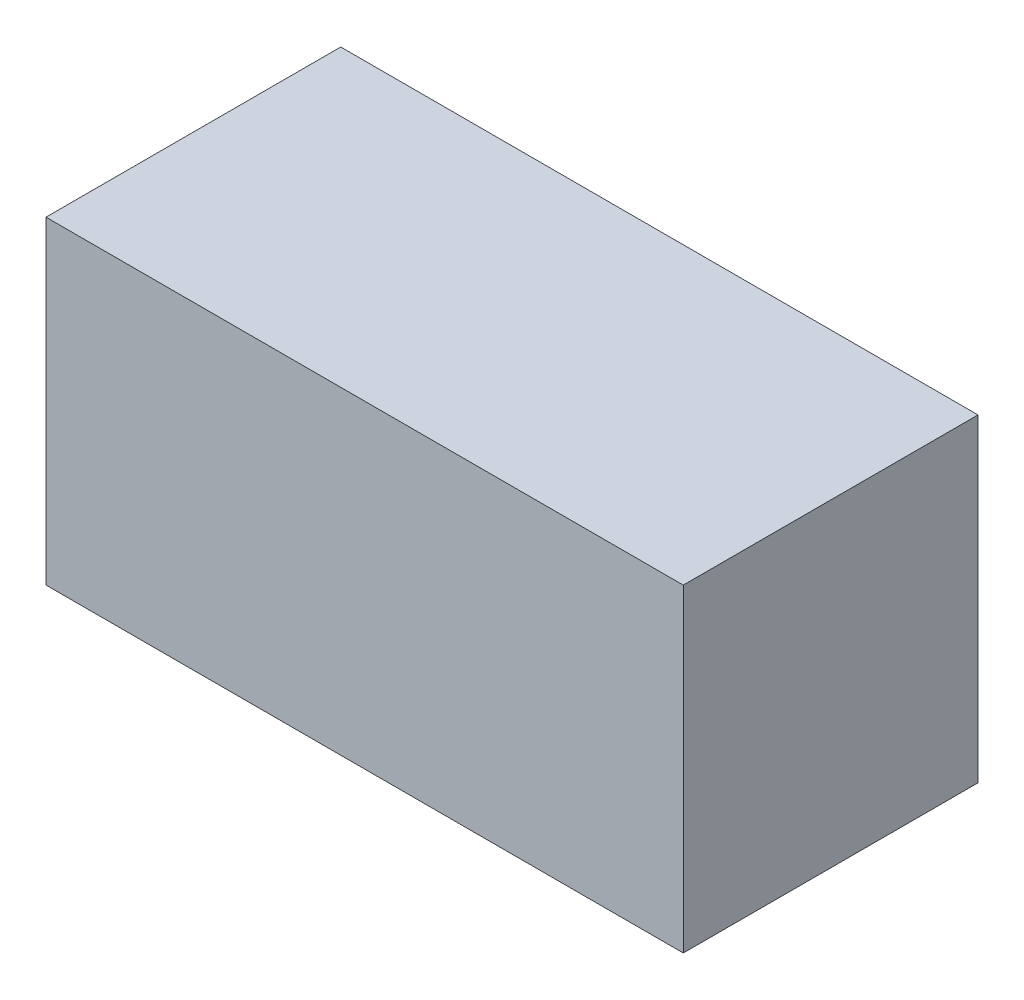
ISO-10303-21;
HEADER;
FILE_DESCRIPTION(('STEP AP214'),'2;1');
FILE_NAME('part.step','',(''),(''),'','','');
FILE_SCHEMA(('AUTOMOTIVE_DESIGN { 1 0 10303 214 1 1 1 1 }'));
ENDSEC;
DATA;
#1=APPLICATION_CONTEXT('core data for automotive mechanical design processes');
#2=APPLICATION_PROTOCOL_DEFINITION('international standard','automotive_design',2000,#1);
#3=PRODUCT_CONTEXT('',#1,'mechanical');
#4=PRODUCT('Part','Part','',(#3));
#5=PRODUCT_RELATED_PRODUCT_CATEGORY('part','',(#4));
#6=PRODUCT_DEFINITION_FORMATION('','',#4);
#7=PRODUCT_DEFINITION_CONTEXT('part definition',#1,'design');
#8=PRODUCT_DEFINITION('design','',#6,#7);
#9=PRODUCT_DEFINITION_SHAPE('','',#8);
#10=(LENGTH_UNIT() NAMED_UNIT(*) SI_UNIT(.MILLI.,.METRE.));
#11=(NAMED_UNIT(*) PLANE_ANGLE_UNIT() SI_UNIT($,.RADIAN.));
#12=(NAMED_UNIT(*) SI_UNIT($,.STERADIAN.) SOLID_ANGLE_UNIT());
#13=UNCERTAINTY_MEASURE_WITH_UNIT(LENGTH_MEASURE(1.E-05),#10,'distance_accuracy_value','');
#14=(GEOMETRIC_REPRESENTATION_CONTEXT(3) GLOBAL_UNCERTAINTY_ASSIGNED_CONTEXT((#13)) GLOBAL_UNIT_ASSIGNED_CONTEXT((#10,
#11,#12)) REPRESENTATION_CONTEXT('',''));
#15=CARTESIAN_POINT('',(0.,0.,0.));
#16=DIRECTION('',(0.,0.,1.));
#17=DIRECTION('',(1.,0.,0.));
#18=AXIS2_PLACEMENT_3D('',#15,#16,#17);
#19=CARTESIAN_POINT('',(-400.,-200.,370.));
#20=DIRECTION('',(0.,1.,0.));
#21=DIRECTION('',(0.,0.,1.));
#22=AXIS2_PLACEMENT_3D('',#19,#20,#21);
#23=PLANE('',#22);
#24=DIRECTION('',(1.,0.,0.));
#25=VECTOR('',#24,1.);
#26=CARTESIAN_POINT('',(-400.,-200.,0.));
#27=LINE('',#26,#25);
#28=CARTESIAN_POINT('',(-400.,-200.,0.));
#29=VERTEX_POINT('',#28);
#30=CARTESIAN_POINT('',(400.,-200.,0.));
#31=VERTEX_POINT('',#30);
#32=EDGE_CURVE('E99',#29,#31,#27,.T.);
#33=ORIENTED_EDGE('',*,*,#32,.T.);
#34=DIRECTION('',(0.,0.,-1.));
#35=VECTOR('',#34,1.);
#36=CARTESIAN_POINT('',(400.,-200.,370.));
#37=LINE('',#36,#35);
#38=CARTESIAN_POINT('',(400.,-200.,370.));
#39=VERTEX_POINT('',#38);
#40=EDGE_CURVE('E11',#39,#31,#37,.T.);
#41=ORIENTED_EDGE('',*,*,#40,.F.);
#42=DIRECTION('',(1.,0.,0.));
#43=VECTOR('',#42,1.);
#44=CARTESIAN_POINT('',(-400.,-200.,370.));
#45=LINE('',#44,#43);
#46=CARTESIAN_POINT('',(-400.,-200.,370.));
#47=VERTEX_POINT('',#46);
#48=EDGE_CURVE('E76',#47,#39,#45,.T.);
#49=ORIENTED_EDGE('',*,*,#48,.F.);
#50=DIRECTION('',(0.,0.,-1.));
#51=VECTOR('',#50,1.);
#52=CARTESIAN_POINT('',(-400.,-200.,370.));
#53=LINE('',#52,#51);
#54=EDGE_CURVE('E95',#47,#29,#53,.T.);
#55=ORIENTED_EDGE('',*,*,#54,.T.);
#56=EDGE_LOOP('',(#33,#41,#49,#55));
#57=FACE_BOUND('',#56,.T.);
#58=ADVANCED_FACE('F37',(#57),#23,.F.);
#59=CARTESIAN_POINT('',(400.,200.,370.));
#60=DIRECTION('',(1.,0.,0.));
#61=DIRECTION('',(0.,1.,0.));
#62=AXIS2_PLACEMENT_3D('',#59,#60,#61);
#63=PLANE('',#62);
#64=DIRECTION('',(0.,-1.,0.));
#65=VECTOR('',#64,1.);
#66=CARTESIAN_POINT('',(400.,200.,0.));
#67=LINE('',#66,#65);
#68=CARTESIAN_POINT('',(400.,200.,0.));
#69=VERTEX_POINT('',#68);
#70=EDGE_CURVE('E85',#69,#31,#67,.T.);
#71=ORIENTED_EDGE('',*,*,#70,.F.);
#72=DIRECTION('',(0.,0.,-1.));
#73=VECTOR('',#72,1.);
#74=CARTESIAN_POINT('',(400.,200.,370.));
#75=LINE('',#74,#73);
#76=CARTESIAN_POINT('',(400.,200.,370.));
#77=VERTEX_POINT('',#76);
#78=EDGE_CURVE('E45',#77,#69,#75,.T.);
#79=ORIENTED_EDGE('',*,*,#78,.F.);
#80=DIRECTION('',(0.,-1.,0.));
#81=VECTOR('',#80,1.);
#82=CARTESIAN_POINT('',(400.,200.,370.));
#83=LINE('',#82,#81);
#84=EDGE_CURVE('E83',#77,#39,#83,.T.);
#85=ORIENTED_EDGE('',*,*,#84,.T.);
#86=ORIENTED_EDGE('',*,*,#40,.T.);
#87=EDGE_LOOP('',(#71,#79,#85,#86));
#88=FACE_BOUND('',#87,.T.);
#89=ADVANCED_FACE('F82',(#88),#63,.T.);
#90=CARTESIAN_POINT('',(-400.,200.,370.));
#91=DIRECTION('',(0.,1.,0.));
#92=DIRECTION('',(0.,0.,1.));
#93=AXIS2_PLACEMENT_3D('',#90,#91,#92);
#94=PLANE('',#93);
#95=DIRECTION('',(1.,0.,0.));
#96=VECTOR('',#95,1.);
#97=CARTESIAN_POINT('',(-400.,200.,0.));
#98=LINE('',#97,#96);
#99=CARTESIAN_POINT('',(-400.,200.,0.));
#100=VERTEX_POINT('',#99);
#101=EDGE_CURVE('E103',#100,#69,#98,.T.);
#102=ORIENTED_EDGE('',*,*,#101,.F.);
#103=DIRECTION('',(0.,0.,-1.));
#104=VECTOR('',#103,1.);
#105=CARTESIAN_POINT('',(-400.,200.,370.));
#106=LINE('',#105,#104);
#107=CARTESIAN_POINT('',(-400.,200.,370.));
#108=VERTEX_POINT('',#107);
#109=EDGE_CURVE('E68',#108,#100,#106,.T.);
#110=ORIENTED_EDGE('',*,*,#109,.F.);
#111=DIRECTION('',(1.,0.,0.));
#112=VECTOR('',#111,1.);
#113=CARTESIAN_POINT('',(-400.,200.,370.));
#114=LINE('',#113,#112);
#115=EDGE_CURVE('E91',#108,#77,#114,.T.);
#116=ORIENTED_EDGE('',*,*,#115,.T.);
#117=ORIENTED_EDGE('',*,*,#78,.T.);
#118=EDGE_LOOP('',(#102,#110,#116,#117));
#119=FACE_BOUND('',#118,.T.);
#120=ADVANCED_FACE('F93',(#119),#94,.T.);
#121=CARTESIAN_POINT('',(-400.,200.,370.));
#122=DIRECTION('',(1.,0.,0.));
#123=DIRECTION('',(0.,1.,0.));
#124=AXIS2_PLACEMENT_3D('',#121,#122,#123);
#125=PLANE('',#124);
#126=DIRECTION('',(0.,-1.,0.));
#127=VECTOR('',#126,1.);
#128=CARTESIAN_POINT('',(-400.,200.,0.));
#129=LINE('',#128,#127);
#130=EDGE_CURVE('E71',#100,#29,#129,.T.);
#131=ORIENTED_EDGE('',*,*,#130,.T.);
#132=ORIENTED_EDGE('',*,*,#54,.F.);
#133=DIRECTION('',(0.,-1.,0.));
#134=VECTOR('',#133,1.);
#135=CARTESIAN_POINT('',(-400.,200.,370.));
#136=LINE('',#135,#134);
#137=EDGE_CURVE('E53',#108,#47,#136,.T.);
#138=ORIENTED_EDGE('',*,*,#137,.F.);
#139=ORIENTED_EDGE('',*,*,#109,.T.);
#140=EDGE_LOOP('',(#131,#132,#138,#139));
#141=FACE_BOUND('',#140,.T.);
#142=ADVANCED_FACE('F116',(#141),#125,.F.);
#143=CARTESIAN_POINT('',(0.,0.,370.));
#144=DIRECTION('',(0.,0.,-1.));
#145=DIRECTION('',(-1.,0.,0.));
#146=AXIS2_PLACEMENT_3D('',#143,#144,#145);
#147=PLANE('',#146);
#148=ORIENTED_EDGE('',*,*,#48,.T.);
#149=ORIENTED_EDGE('',*,*,#84,.F.);
#150=ORIENTED_EDGE('',*,*,#115,.F.);
#151=ORIENTED_EDGE('',*,*,#137,.T.);
#152=EDGE_LOOP('',(#148,#149,#150,#151));
#153=FACE_BOUND('',#152,.T.);
#154=ADVANCED_FACE('F90',(#153),#147,.F.);
#155=CARTESIAN_POINT('',(0.,0.,0.));
#156=DIRECTION('',(0.,0.,-1.));
#157=DIRECTION('',(-1.,0.,0.));
#158=AXIS2_PLACEMENT_3D('',#155,#156,#157);
#159=PLANE('',#158);
#160=ORIENTED_EDGE('',*,*,#32,.F.);
#161=ORIENTED_EDGE('',*,*,#130,.F.);
#162=ORIENTED_EDGE('',*,*,#101,.T.);
#163=ORIENTED_EDGE('',*,*,#70,.T.);
#164=EDGE_LOOP('',(#160,#161,#162,#163));
#165=FACE_BOUND('',#164,.T.);
#166=ADVANCED_FACE('F110',(#165),#159,.T.);
#167=CLOSED_SHELL('',(#58,#89,#120,#142,#154,#166));
#168=MANIFOLD_SOLID_BREP('B2',#167);
#169=ADVANCED_BREP_SHAPE_REPRESENTATION('',(#18,#168),#14);
#170=SHAPE_DEFINITION_REPRESENTATION(#9,#169);
ENDSEC;
END-ISO-10303-21;
